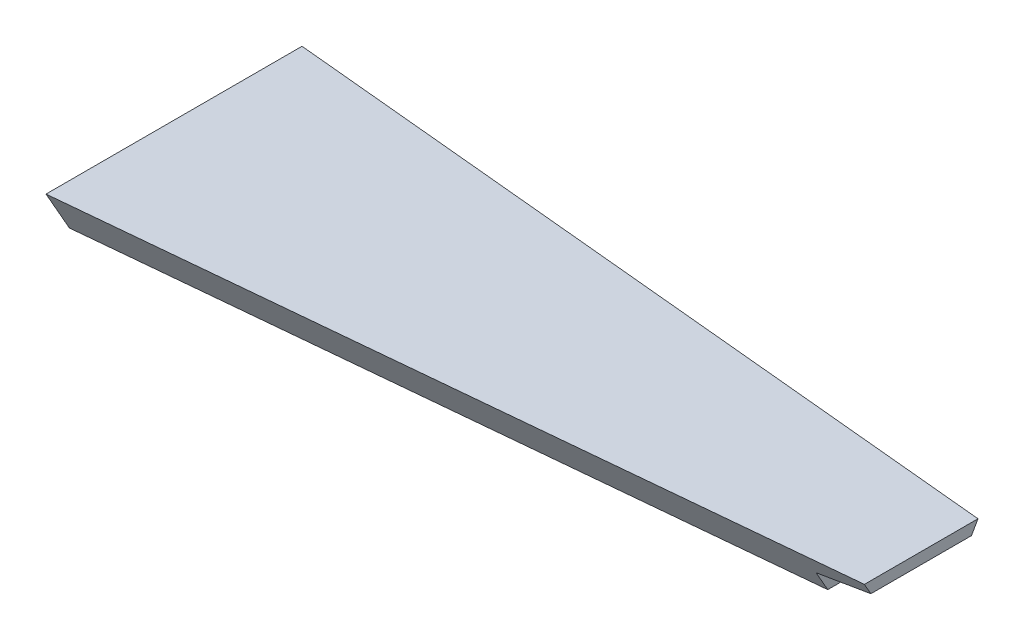
ISO-10303-21;
HEADER;
FILE_DESCRIPTION(('STEP AP214'),'2;1');
FILE_NAME('part.step','',(''),(''),'','','');
FILE_SCHEMA(('AUTOMOTIVE_DESIGN { 1 0 10303 214 1 1 1 1 }'));
ENDSEC;
DATA;
#1=APPLICATION_CONTEXT('core data for automotive mechanical design processes');
#2=APPLICATION_PROTOCOL_DEFINITION('international standard','automotive_design',2000,#1);
#3=PRODUCT_CONTEXT('',#1,'mechanical');
#4=PRODUCT('Part','Part','',(#3));
#5=PRODUCT_RELATED_PRODUCT_CATEGORY('part','',(#4));
#6=PRODUCT_DEFINITION_FORMATION('','',#4);
#7=PRODUCT_DEFINITION_CONTEXT('part definition',#1,'design');
#8=PRODUCT_DEFINITION('design','',#6,#7);
#9=PRODUCT_DEFINITION_SHAPE('','',#8);
#10=(LENGTH_UNIT() NAMED_UNIT(*) SI_UNIT(.MILLI.,.METRE.));
#11=(NAMED_UNIT(*) PLANE_ANGLE_UNIT() SI_UNIT($,.RADIAN.));
#12=(NAMED_UNIT(*) SI_UNIT($,.STERADIAN.) SOLID_ANGLE_UNIT());
#13=UNCERTAINTY_MEASURE_WITH_UNIT(LENGTH_MEASURE(1.E-05),#10,'distance_accuracy_value','');
#14=(GEOMETRIC_REPRESENTATION_CONTEXT(3) GLOBAL_UNCERTAINTY_ASSIGNED_CONTEXT((#13)) GLOBAL_UNIT_ASSIGNED_CONTEXT((#10,
#11,#12)) REPRESENTATION_CONTEXT('',''));
#15=CARTESIAN_POINT('',(0.,0.,0.));
#16=DIRECTION('',(0.,0.,1.));
#17=DIRECTION('',(1.,0.,0.));
#18=AXIS2_PLACEMENT_3D('',#15,#16,#17);
#19=CARTESIAN_POINT('',(346.244171738481,0.,32.9937039600237));
#20=DIRECTION('',(0.0825238029303358,-0.493142800768617,-0.866025403784438));
#21=DIRECTION('',(0.,0.868989445240945,-0.494830621586653));
#22=AXIS2_PLACEMENT_3D('',#19,#20,#21);
#23=PLANE('',#22);
#24=DIRECTION('',(-0.986285601537232,-0.165047605860675,0.));
#25=VECTOR('',#24,1.);
#26=CARTESIAN_POINT('',(344.00173931299,13.4002477778976,25.1494886032158));
#27=LINE('',#26,#25);
#28=CARTESIAN_POINT('',(320.844171738481,9.525,25.1494886032158));
#29=VERTEX_POINT('',#28);
#30=CARTESIAN_POINT('',(346.244171738481,13.775502270668,25.1494886032158));
#31=VERTEX_POINT('',#30);
#32=EDGE_CURVE('E50',#29,#31,#27,.F.);
#33=ORIENTED_EDGE('',*,*,#32,.F.);
#34=DIRECTION('',(0.,-0.868989445240945,0.494830621586653));
#35=VECTOR('',#34,1.);
#36=CARTESIAN_POINT('',(320.844171738481,-1.04076669691603,31.1659769861385));
#37=LINE('',#36,#35);
#38=CARTESIAN_POINT('',(320.844171738481,0.,30.5733308563355));
#39=VERTEX_POINT('',#38);
#40=EDGE_CURVE('E101',#39,#29,#37,.F.);
#41=ORIENTED_EDGE('',*,*,#40,.F.);
#42=DIRECTION('',(-0.995490568200444,0.,-0.0948605746554172));
#43=VECTOR('',#42,1.);
#44=CARTESIAN_POINT('',(346.244171738481,0.,32.9937039600237));
#45=LINE('',#44,#43);
#46=CARTESIAN_POINT('',(0.,0.,0.));
#47=VERTEX_POINT('',#46);
#48=EDGE_CURVE('E57',#39,#47,#45,.T.);
#49=ORIENTED_EDGE('',*,*,#48,.T.);
#50=DIRECTION('',(0.,0.868989445240945,-0.494830621586654));
#51=VECTOR('',#50,1.);
#52=CARTESIAN_POINT('',(0.,-14.1873780687672,8.07875072234782));
#53=LINE('',#52,#51);
#54=CARTESIAN_POINT('',(0.,19.05,-10.8476845062394));
#55=VERTEX_POINT('',#54);
#56=EDGE_CURVE('E124',#55,#47,#53,.F.);
#57=ORIENTED_EDGE('',*,*,#56,.F.);
#58=DIRECTION('',(0.995490568200445,0.,0.0948605746554172));
#59=VECTOR('',#58,1.);
#60=CARTESIAN_POINT('',(347.268549039799,19.05,22.2436326533174));
#61=LINE('',#60,#59);
#62=CARTESIAN_POINT('',(346.244171738481,19.05,22.1460194537843));
#63=VERTEX_POINT('',#62);
#64=EDGE_CURVE('E130',#63,#55,#61,.F.);
#65=ORIENTED_EDGE('',*,*,#64,.F.);
#66=DIRECTION('',(0.,-0.868989445240945,0.494830621586654));
#67=VECTOR('',#66,1.);
#68=CARTESIAN_POINT('',(346.244171738481,0.,32.9937039600237));
#69=LINE('',#68,#67);
#70=EDGE_CURVE('E117',#31,#63,#69,.F.);
#71=ORIENTED_EDGE('',*,*,#70,.F.);
#72=EDGE_LOOP('',(#33,#41,#49,#57,#65,#71));
#73=FACE_BOUND('',#72,.T.);
#74=ADVANCED_FACE('F35',(#73),#23,.T.);
#75=CARTESIAN_POINT('',(0.,0.,96.9373079200475));
#76=DIRECTION('',(0.0825238029303361,-0.493142800768617,0.866025403784438));
#77=DIRECTION('',(0.,-0.868989445240945,-0.494830621586653));
#78=AXIS2_PLACEMENT_3D('',#75,#76,#77);
#79=PLANE('',#78);
#80=DIRECTION('',(0.986285601537232,0.165047605860675,0.));
#81=VECTOR('',#80,1.);
#82=CARTESIAN_POINT('',(7.18950540788247,-42.9627902143234,71.787819316831));
#83=LINE('',#82,#81);
#84=CARTESIAN_POINT('',(346.244171738481,13.775502270668,71.7878193168315));
#85=VERTEX_POINT('',#84);
#86=CARTESIAN_POINT('',(320.844171738481,9.525,71.7878193168315));
#87=VERTEX_POINT('',#86);
#88=EDGE_CURVE('E88',#85,#87,#83,.F.);
#89=ORIENTED_EDGE('',*,*,#88,.F.);
#90=DIRECTION('',(0.,0.868989445240945,0.494830621586654));
#91=VECTOR('',#90,1.);
#92=CARTESIAN_POINT('',(346.244171738481,14.1873780687672,72.0223546823715));
#93=LINE('',#92,#91);
#94=CARTESIAN_POINT('',(346.244171738481,19.05,74.791288466263));
#95=VERTEX_POINT('',#94);
#96=EDGE_CURVE('E115',#95,#85,#93,.F.);
#97=ORIENTED_EDGE('',*,*,#96,.F.);
#98=DIRECTION('',(-0.995490568200445,0.,0.0948605746554175));
#99=VECTOR('',#98,1.);
#100=CARTESIAN_POINT('',(1.0243773013182,19.05,107.687379226754));
#101=LINE('',#100,#99);
#102=CARTESIAN_POINT('',(0.,19.05,107.784992426287));
#103=VERTEX_POINT('',#102);
#104=EDGE_CURVE('E43',#103,#95,#101,.F.);
#105=ORIENTED_EDGE('',*,*,#104,.F.);
#106=DIRECTION('',(0.,-0.868989445240945,-0.494830621586654));
#107=VECTOR('',#106,1.);
#108=CARTESIAN_POINT('',(0.,0.,96.9373079200475));
#109=LINE('',#108,#107);
#110=CARTESIAN_POINT('',(0.,0.,96.9373079200474));
#111=VERTEX_POINT('',#110);
#112=EDGE_CURVE('E122',#111,#103,#109,.F.);
#113=ORIENTED_EDGE('',*,*,#112,.F.);
#114=DIRECTION('',(0.995490568200444,0.,-0.0948605746554175));
#115=VECTOR('',#114,1.);
#116=CARTESIAN_POINT('',(0.,0.,96.9373079200475));
#117=LINE('',#116,#115);
#118=CARTESIAN_POINT('',(320.844171738481,0.,66.3639770637118));
#119=VERTEX_POINT('',#118);
#120=EDGE_CURVE('E107',#111,#119,#117,.T.);
#121=ORIENTED_EDGE('',*,*,#120,.T.);
#122=DIRECTION('',(0.,0.868989445240945,0.494830621586653));
#123=VECTOR('',#122,1.);
#124=CARTESIAN_POINT('',(320.844171738481,13.1466113718512,73.8500816562567));
#125=LINE('',#124,#123);
#126=EDGE_CURVE('E99',#87,#119,#125,.F.);
#127=ORIENTED_EDGE('',*,*,#126,.F.);
#128=EDGE_LOOP('',(#89,#97,#105,#113,#121,#127));
#129=FACE_BOUND('',#128,.T.);
#130=ADVANCED_FACE('F37',(#129),#79,.T.);
#131=CARTESIAN_POINT('',(0.,0.,0.));
#132=DIRECTION('',(0.,1.,0.));
#133=DIRECTION('',(0.,0.,1.));
#134=AXIS2_PLACEMENT_3D('',#131,#132,#133);
#135=PLANE('',#134);
#136=DIRECTION('',(0.,0.,-1.));
#137=VECTOR('',#136,1.);
#138=CARTESIAN_POINT('',(320.844171738481,0.,107.784992426287));
#139=LINE('',#138,#137);
#140=EDGE_CURVE('E102',#119,#39,#139,.T.);
#141=ORIENTED_EDGE('',*,*,#140,.F.);
#142=ORIENTED_EDGE('',*,*,#120,.F.);
#143=DIRECTION('',(0.,0.,1.));
#144=VECTOR('',#143,1.);
#145=CARTESIAN_POINT('',(0.,0.,0.));
#146=LINE('',#145,#144);
#147=EDGE_CURVE('E127',#47,#111,#146,.T.);
#148=ORIENTED_EDGE('',*,*,#147,.F.);
#149=ORIENTED_EDGE('',*,*,#48,.F.);
#150=EDGE_LOOP('',(#141,#142,#148,#149));
#151=FACE_BOUND('',#150,.T.);
#152=ADVANCED_FACE('F144',(#151),#135,.F.);
#153=CARTESIAN_POINT('',(346.244171738481,0.,-11.8767020921819));
#154=DIRECTION('',(1.,0.,0.));
#155=DIRECTION('',(0.,0.,-1.));
#156=AXIS2_PLACEMENT_3D('',#153,#154,#155);
#157=PLANE('',#156);
#158=ORIENTED_EDGE('',*,*,#96,.T.);
#159=DIRECTION('',(0.,0.,-1.));
#160=VECTOR('',#159,1.);
#161=CARTESIAN_POINT('',(346.244171738481,13.775502270668,-11.8767020921819));
#162=LINE('',#161,#160);
#163=EDGE_CURVE('E12',#85,#31,#162,.T.);
#164=ORIENTED_EDGE('',*,*,#163,.T.);
#165=ORIENTED_EDGE('',*,*,#70,.T.);
#166=DIRECTION('',(0.,0.,-1.));
#167=VECTOR('',#166,1.);
#168=CARTESIAN_POINT('',(346.244171738481,19.05,0.));
#169=LINE('',#168,#167);
#170=EDGE_CURVE('E109',#95,#63,#169,.T.);
#171=ORIENTED_EDGE('',*,*,#170,.F.);
#172=EDGE_LOOP('',(#158,#164,#165,#171));
#173=FACE_BOUND('',#172,.T.);
#174=ADVANCED_FACE('F138',(#173),#157,.T.);
#175=CARTESIAN_POINT('',(0.,19.05,0.));
#176=DIRECTION('',(0.,1.,0.));
#177=DIRECTION('',(0.,0.,1.));
#178=AXIS2_PLACEMENT_3D('',#175,#176,#177);
#179=PLANE('',#178);
#180=ORIENTED_EDGE('',*,*,#64,.T.);
#181=DIRECTION('',(0.,0.,1.));
#182=VECTOR('',#181,1.);
#183=CARTESIAN_POINT('',(0.,19.05,0.));
#184=LINE('',#183,#182);
#185=EDGE_CURVE('E119',#55,#103,#184,.T.);
#186=ORIENTED_EDGE('',*,*,#185,.T.);
#187=ORIENTED_EDGE('',*,*,#104,.T.);
#188=ORIENTED_EDGE('',*,*,#170,.T.);
#189=EDGE_LOOP('',(#180,#186,#187,#188));
#190=FACE_BOUND('',#189,.T.);
#191=ADVANCED_FACE('F135',(#190),#179,.T.);
#192=CARTESIAN_POINT('',(0.,0.,-11.8767020921819));
#193=DIRECTION('',(-1.,0.,0.));
#194=DIRECTION('',(0.,0.,1.));
#195=AXIS2_PLACEMENT_3D('',#192,#193,#194);
#196=PLANE('',#195);
#197=ORIENTED_EDGE('',*,*,#56,.T.);
#198=ORIENTED_EDGE('',*,*,#147,.T.);
#199=ORIENTED_EDGE('',*,*,#112,.T.);
#200=ORIENTED_EDGE('',*,*,#185,.F.);
#201=EDGE_LOOP('',(#197,#198,#199,#200));
#202=FACE_BOUND('',#201,.T.);
#203=ADVANCED_FACE('F142',(#202),#196,.T.);
#204=CARTESIAN_POINT('',(320.844171738481,0.,107.784992426287));
#205=DIRECTION('',(1.,0.,0.));
#206=DIRECTION('',(0.,0.,-1.));
#207=AXIS2_PLACEMENT_3D('',#204,#205,#206);
#208=PLANE('',#207);
#209=ORIENTED_EDGE('',*,*,#40,.T.);
#210=DIRECTION('',(0.,0.,-1.));
#211=VECTOR('',#210,1.);
#212=CARTESIAN_POINT('',(320.844171738481,9.525,107.784992426287));
#213=LINE('',#212,#211);
#214=EDGE_CURVE('E91',#87,#29,#213,.T.);
#215=ORIENTED_EDGE('',*,*,#214,.F.);
#216=ORIENTED_EDGE('',*,*,#126,.T.);
#217=ORIENTED_EDGE('',*,*,#140,.T.);
#218=EDGE_LOOP('',(#209,#215,#216,#217));
#219=FACE_BOUND('',#218,.T.);
#220=ADVANCED_FACE('F98',(#219),#208,.T.);
#221=CARTESIAN_POINT('',(320.844171738481,9.525,107.784992426287));
#222=DIRECTION('',(0.165047605860675,-0.986285601537232,0.));
#223=DIRECTION('',(0.986285601537232,0.165047605860675,0.));
#224=AXIS2_PLACEMENT_3D('',#221,#222,#223);
#225=PLANE('',#224);
#226=ORIENTED_EDGE('',*,*,#32,.T.);
#227=ORIENTED_EDGE('',*,*,#163,.F.);
#228=ORIENTED_EDGE('',*,*,#88,.T.);
#229=ORIENTED_EDGE('',*,*,#214,.T.);
#230=EDGE_LOOP('',(#226,#227,#228,#229));
#231=FACE_BOUND('',#230,.T.);
#232=ADVANCED_FACE('F90',(#231),#225,.T.);
#233=CLOSED_SHELL('',(#74,#130,#152,#174,#191,#203,#220,#232));
#234=MANIFOLD_SOLID_BREP('B2',#233);
#235=ADVANCED_BREP_SHAPE_REPRESENTATION('',(#18,#234),#14);
#236=SHAPE_DEFINITION_REPRESENTATION(#9,#235);
ENDSEC;
END-ISO-10303-21;
